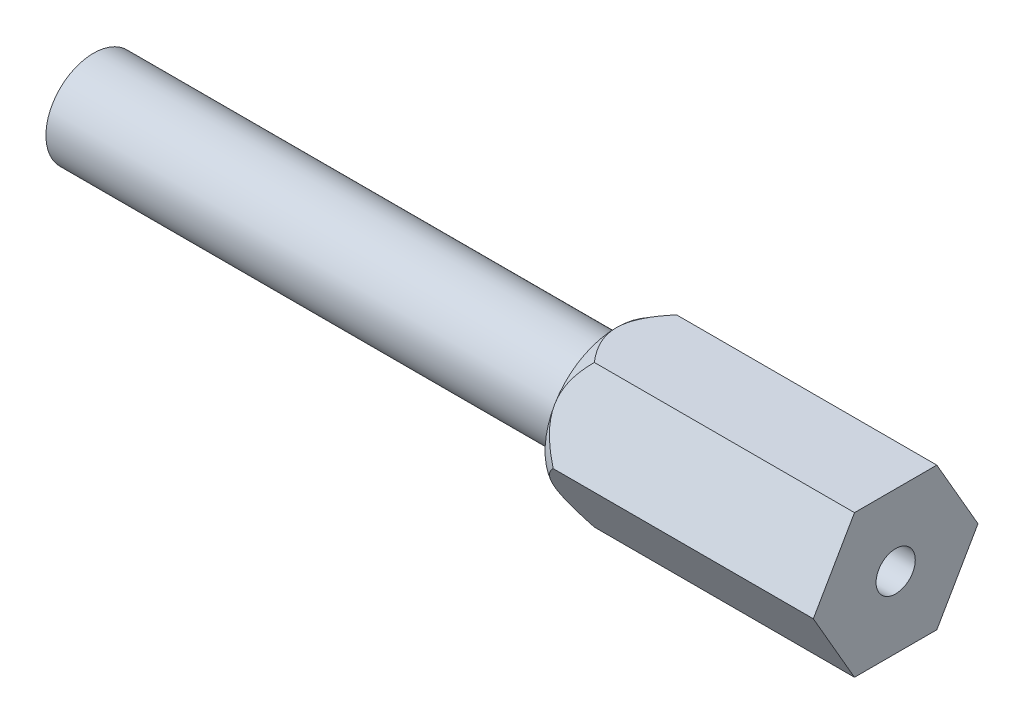
ISO-10303-21;
HEADER;
FILE_DESCRIPTION(('STEP AP214'),'2;1');
FILE_NAME('part.step','',(''),(''),'','','');
FILE_SCHEMA(('AUTOMOTIVE_DESIGN { 1 0 10303 214 1 1 1 1 }'));
ENDSEC;
DATA;
#1=APPLICATION_CONTEXT('core data for automotive mechanical design processes');
#2=APPLICATION_PROTOCOL_DEFINITION('international standard','automotive_design',2000,#1);
#3=PRODUCT_CONTEXT('',#1,'mechanical');
#4=PRODUCT('Part','Part','',(#3));
#5=PRODUCT_RELATED_PRODUCT_CATEGORY('part','',(#4));
#6=PRODUCT_DEFINITION_FORMATION('','',#4);
#7=PRODUCT_DEFINITION_CONTEXT('part definition',#1,'design');
#8=PRODUCT_DEFINITION('design','',#6,#7);
#9=PRODUCT_DEFINITION_SHAPE('','',#8);
#10=(LENGTH_UNIT() NAMED_UNIT(*) SI_UNIT(.MILLI.,.METRE.));
#11=(NAMED_UNIT(*) PLANE_ANGLE_UNIT() SI_UNIT($,.RADIAN.));
#12=(NAMED_UNIT(*) SI_UNIT($,.STERADIAN.) SOLID_ANGLE_UNIT());
#13=UNCERTAINTY_MEASURE_WITH_UNIT(LENGTH_MEASURE(1.E-05),#10,'distance_accuracy_value','');
#14=(GEOMETRIC_REPRESENTATION_CONTEXT(3) GLOBAL_UNCERTAINTY_ASSIGNED_CONTEXT((#13)) GLOBAL_UNIT_ASSIGNED_CONTEXT((#10,
#11,#12)) REPRESENTATION_CONTEXT('',''));
#15=CARTESIAN_POINT('',(0.,0.,0.));
#16=DIRECTION('',(0.,0.,1.));
#17=DIRECTION('',(1.,0.,0.));
#18=AXIS2_PLACEMENT_3D('',#15,#16,#17);
#19=CARTESIAN_POINT('',(-67.5,-5.99999999999996,-3.46410161513783));
#20=DIRECTION('',(0.,-0.499999999999995,-0.866025403784441));
#21=DIRECTION('',(0.,0.866025403784442,-0.499999999999995));
#22=AXIS2_PLACEMENT_3D('',#19,#20,#21);
#23=PLANE('',#22);
#24=CARTESIAN_POINT('',(-21.8921048454132,0.000199995000340876,-6.9283186974428));
#25=CARTESIAN_POINT('',(-21.9548567608909,-0.0625552143430573,-6.89208696043534));
#26=CARTESIAN_POINT('',(-22.0167717261081,-0.125936602015651,-6.85549369920095));
#27=CARTESIAN_POINT('',(-22.1386944411042,-0.254089561609669,-6.7815045534819));
#28=CARTESIAN_POINT('',(-22.1987016418154,-0.318861524921655,-6.74410844302778));
#29=CARTESIAN_POINT('',(-22.3760584208944,-0.516083251212475,-6.63024242626374));
#30=CARTESIAN_POINT('',(-22.4900986231927,-0.650802011472642,-6.55246251376264));
#31=CARTESIAN_POINT('',(-22.7093057282271,-0.930726936783738,-6.39084778278139));
#32=CARTESIAN_POINT('',(-22.8141672543392,-1.07611413083928,-6.3069084471567));
#33=CARTESIAN_POINT('',(-23.0071765097268,-1.37476445413351,-6.13448260260921));
#34=CARTESIAN_POINT('',(-23.0953611949531,-1.52800918910396,-6.04600671362213));
#35=CARTESIAN_POINT('',(-23.2145100111916,-1.77089176583291,-5.90577839256621));
#36=CARTESIAN_POINT('',(-23.253235171572,-1.85768641614649,-5.85566747784344));
#37=CARTESIAN_POINT('',(-23.3231790903496,-2.0335489364393,-5.75413320441203));
#38=CARTESIAN_POINT('',(-23.3543972867018,-2.12261697607485,-5.70270974775224));
#39=CARTESIAN_POINT('',(-23.4081338669026,-2.301963377707,-5.59916405449173));
#40=CARTESIAN_POINT('',(-23.4307191663737,-2.39222657619592,-5.54705057254624));
#41=CARTESIAN_POINT('',(-23.4667215256768,-2.57411139100415,-5.44203932575521));
#42=CARTESIAN_POINT('',(-23.4801403006542,-2.66573274991882,-5.3891417095223));
#43=CARTESIAN_POINT('',(-23.4973532223384,-2.85050959355515,-5.28246074910886));
#44=CARTESIAN_POINT('',(-23.5010575383414,-2.94367143510179,-5.22867373481371));
#45=CARTESIAN_POINT('',(-23.4984218187315,-3.12988635018736,-5.12116250346193));
#46=CARTESIAN_POINT('',(-23.4920818176313,-3.22293942409892,-5.06743828619017));
#47=CARTESIAN_POINT('',(-23.4696052794702,-3.40835003775883,-4.96039141848301));
#48=CARTESIAN_POINT('',(-23.4534474398254,-3.50070562169227,-4.90706989723787));
#49=CARTESIAN_POINT('',(-23.4119579381049,-3.68389443017688,-4.80130578934676));
#50=CARTESIAN_POINT('',(-23.3866207527425,-3.77472670363747,-4.74886375181318));
#51=CARTESIAN_POINT('',(-23.3191529556127,-3.98026137184518,-4.63019825579566));
#52=CARTESIAN_POINT('',(-23.2742862871462,-4.0942898052736,-4.56436390906049));
#53=CARTESIAN_POINT('',(-23.1729245447686,-4.31841563544126,-4.43496480068085));
#54=CARTESIAN_POINT('',(-23.1164222964055,-4.42851055740832,-4.37140146784675));
#55=CARTESIAN_POINT('',(-22.9936220337617,-4.64503724591743,-4.24638972594929));
#56=CARTESIAN_POINT('',(-22.9272854080946,-4.75145243651704,-4.18495088701073));
#57=CARTESIAN_POINT('',(-22.7868049371953,-4.9602797801282,-4.06438436396268));
#58=CARTESIAN_POINT('',(-22.7126623768061,-5.06269258813143,-4.00525630169355));
#59=CARTESIAN_POINT('',(-22.522038683969,-5.31069121272564,-3.86207422902543));
#60=CARTESIAN_POINT('',(-22.4019173129312,-5.45417752270937,-3.7792323693313));
#61=CARTESIAN_POINT('',(-22.2149227160965,-5.66348169593888,-3.65839054857473));
#62=CARTESIAN_POINT('',(-22.1518313066628,-5.73189180456144,-3.6188939539462));
#63=CARTESIAN_POINT('',(-22.0235053566614,-5.86716554714801,-3.54079362224956));
#64=CARTESIAN_POINT('',(-21.9582712611933,-5.93402949743867,-3.50218970255017));
#65=CARTESIAN_POINT('',(-21.8921048454132,-6.0001999950003,-3.46398614797055));
#66=B_SPLINE_CURVE_WITH_KNOTS('',3,(#24,#25,#26,#27,#28,#29,#30,#31,#32,#33,#34,#35,#36,#37,#38,
#39,#40,#41,#42,#43,#44,#45,#46,#47,#48,#49,#50,#51,#52,#53,#54,#55,#56,#57,#58,#59,#60,#61,#62,
#63,#64,#65),.UNSPECIFIED.,.F.,.F.,(4,2,2,2,2,2,2,2,2,2,2,2,2,2,2,2,2,2,2,2,4),(0.,
0.28756100822779,0.575204042743462,1.15341981754294,1.74657454533942,2.33839902909644,
2.66048498841609,2.98259505474562,3.30215513549797,3.6216554070741,3.94409988279589,
4.26654325058649,4.58968876152158,4.91302903555297,5.3296565678419,5.74654176433873,
6.16510933349185,6.58360811456267,7.196955652563,7.50021905004793,7.80341984425696),.UNSPECIFIED.);
#67=CARTESIAN_POINT('',(-21.8923048454132,0.,-6.92820323027551));
#68=VERTEX_POINT('',#67);
#69=CARTESIAN_POINT('',(-23.5,-2.99999999999998,-5.19615242270667));
#70=VERTEX_POINT('',#69);
#71=EDGE_CURVE('E123',#68,#70,#66,.T.);
#72=ORIENTED_EDGE('',*,*,#71,.F.);
#73=DIRECTION('',(1.,0.,0.));
#74=VECTOR('',#73,1.);
#75=CARTESIAN_POINT('',(-67.5,0.,-6.92820323027551));
#76=LINE('',#75,#74);
#77=CARTESIAN_POINT('',(0.,0.,-6.92820323027551));
#78=VERTEX_POINT('',#77);
#79=EDGE_CURVE('E130',#68,#78,#76,.T.);
#80=ORIENTED_EDGE('',*,*,#79,.T.);
#81=DIRECTION('',(0.,0.866025403784441,-0.499999999999995));
#82=VECTOR('',#81,1.);
#83=CARTESIAN_POINT('',(0.,-5.99999999999996,-3.46410161513783));
#84=LINE('',#83,#82);
#85=CARTESIAN_POINT('',(0.,-5.99999999999996,-3.46410161513783));
#86=VERTEX_POINT('',#85);
#87=EDGE_CURVE('E162',#86,#78,#84,.T.);
#88=ORIENTED_EDGE('',*,*,#87,.F.);
#89=DIRECTION('',(1.,0.,0.));
#90=VECTOR('',#89,1.);
#91=CARTESIAN_POINT('',(-67.5,-5.99999999999996,-3.46410161513783));
#92=LINE('',#91,#90);
#93=CARTESIAN_POINT('',(-21.8923048454132,-5.99999999999996,-3.46410161513783));
#94=VERTEX_POINT('',#93);
#95=EDGE_CURVE('E64',#94,#86,#92,.T.);
#96=ORIENTED_EDGE('',*,*,#95,.F.);
#97=EDGE_CURVE('E132',#70,#94,#66,.T.);
#98=ORIENTED_EDGE('',*,*,#97,.F.);
#99=EDGE_LOOP('',(#72,#80,#88,#96,#98));
#100=FACE_BOUND('',#99,.T.);
#101=ADVANCED_FACE('F37',(#100),#23,.T.);
#102=CARTESIAN_POINT('',(-67.5,-6.00000000000004,3.4641016151377));
#103=DIRECTION('',(0.,-1.,0.));
#104=DIRECTION('',(0.,0.,-1.));
#105=AXIS2_PLACEMENT_3D('',#102,#103,#104);
#106=PLANE('',#105);
#107=CARTESIAN_POINT('',(-19.1251268648373,-5.99999999999994,-6.05721458290324));
#108=CARTESIAN_POINT('',(-19.2797348823343,-5.99999999999994,-5.93154496881868));
#109=CARTESIAN_POINT('',(-19.4334292818163,-5.99999999999994,-5.80473415430144));
#110=CARTESIAN_POINT('',(-19.7385950984431,-5.99999999999994,-5.54838639242511));
#111=CARTESIAN_POINT('',(-19.8900659124382,-5.99999999999994,-5.41884872777824));
#112=CARTESIAN_POINT('',(-20.1917074141577,-5.99999999999995,-5.15544627120731));
#113=CARTESIAN_POINT('',(-20.3418527635634,-5.99999999999995,-5.02155237276275));
#114=CARTESIAN_POINT('',(-20.6387575536055,-5.99999999999995,-4.75007974004604));
#115=CARTESIAN_POINT('',(-20.7855173113866,-5.99999999999995,-4.61250135354798));
#116=CARTESIAN_POINT('',(-21.0842684881926,-5.99999999999995,-4.32390846348654));
#117=CARTESIAN_POINT('',(-21.235979247956,-5.99999999999996,-4.17260209237981));
#118=CARTESIAN_POINT('',(-21.5333620816658,-5.99999999999996,-3.86405664967895));
#119=CARTESIAN_POINT('',(-21.679032607606,-5.99999999999996,-3.70681607673503));
#120=CARTESIAN_POINT('',(-21.9618513139366,-5.99999999999996,-3.3858913195862));
#121=CARTESIAN_POINT('',(-22.0990304485888,-5.99999999999997,-3.22223458729759));
#122=CARTESIAN_POINT('',(-22.3627505411691,-5.99999999999997,-2.88662069742006));
#123=CARTESIAN_POINT('',(-22.489298719563,-5.99999999999997,-2.71466930052393));
#124=CARTESIAN_POINT('',(-22.686703760084,-5.99999999999998,-2.42208479767754));
#125=CARTESIAN_POINT('',(-22.7616955981273,-5.99999999999998,-2.30424771174366));
#126=CARTESIAN_POINT('',(-22.9040590291489,-5.99999999999998,-2.06396128472085));
#127=CARTESIAN_POINT('',(-22.971428128924,-5.99999999999998,-1.94151045194878));
#128=CARTESIAN_POINT('',(-23.0961414157094,-5.99999999999998,-1.69303843986658));
#129=CARTESIAN_POINT('',(-23.1535757798036,-5.99999999999998,-1.56706292045833));
#130=CARTESIAN_POINT('',(-23.2571716862758,-5.99999999999999,-1.31055104954188));
#131=CARTESIAN_POINT('',(-23.3033384316727,-5.99999999999999,-1.18001683504268));
#132=CARTESIAN_POINT('',(-23.3718875490916,-5.99999999999999,-0.949898826116907));
#133=CARTESIAN_POINT('',(-23.3973316025657,-5.99999999999999,-0.851225633463846));
#134=CARTESIAN_POINT('',(-23.4401902243902,-5.99999999999999,-0.652158326464795));
#135=CARTESIAN_POINT('',(-23.4576070529728,-5.99999999999999,-0.55176470480922));
#136=CARTESIAN_POINT('',(-23.4838061182648,-6.,-0.349871060508904));
#137=CARTESIAN_POINT('',(-23.4925903895644,-6.,-0.248371304271603));
#138=CARTESIAN_POINT('',(-23.5011997537673,-6.,-0.044987098022777));
#139=CARTESIAN_POINT('',(-23.501024656561,-6.,0.0568973601059055));
#140=CARTESIAN_POINT('',(-23.4917193443625,-6.,0.260214020698756));
#141=CARTESIAN_POINT('',(-23.4825928452086,-6.,0.361646393278742));
#142=CARTESIAN_POINT('',(-23.4557455339872,-6.00000000000001,0.563381112892102));
#143=CARTESIAN_POINT('',(-23.4380211812275,-6.00000000000001,0.663682976941724));
#144=CARTESIAN_POINT('',(-23.3728010208663,-6.00000000000001,0.96200488659224));
#145=CARTESIAN_POINT('',(-23.3132566371592,-6.00000000000001,1.15746797749296));
#146=CARTESIAN_POINT('',(-23.1837449392171,-6.00000000000002,1.49874927862231));
#147=CARTESIAN_POINT('',(-23.1185040032049,-6.00000000000002,1.64645301725931));
#148=CARTESIAN_POINT('',(-22.9752415346378,-6.00000000000002,1.935612851291));
#149=CARTESIAN_POINT('',(-22.8972112698493,-6.00000000000002,2.07706459360795));
#150=CARTESIAN_POINT('',(-22.7302167755532,-6.00000000000002,2.35541801279149));
#151=CARTESIAN_POINT('',(-22.6411413141934,-6.00000000000003,2.49225219046443));
#152=CARTESIAN_POINT('',(-22.5015429714976,-6.00000000000003,2.69324571929462));
#153=CARTESIAN_POINT('',(-22.4540222773795,-6.00000000000003,2.75952173222918));
#154=CARTESIAN_POINT('',(-22.3571934913056,-6.00000000000003,2.89075343237864));
#155=CARTESIAN_POINT('',(-22.3078854412316,-6.00000000000003,2.95570915047553));
#156=CARTESIAN_POINT('',(-22.1488723217305,-6.00000000000003,3.15991025709909));
#157=CARTESIAN_POINT('',(-22.036210902955,-6.00000000000004,3.29685943270153));
#158=CARTESIAN_POINT('',(-21.8050177330924,-6.00000000000004,3.56573231122703));
#159=CARTESIAN_POINT('',(-21.6864842676741,-6.00000000000004,3.69765452641472));
#160=CARTESIAN_POINT('',(-21.4446467646935,-6.00000000000004,3.95727874151413));
#161=CARTESIAN_POINT('',(-21.321338162366,-6.00000000000004,4.08497647551761));
#162=CARTESIAN_POINT('',(-21.0709468238773,-6.00000000000005,4.33662578482552));
#163=CARTESIAN_POINT('',(-20.9438636942032,-6.00000000000005,4.46057696679622));
#164=CARTESIAN_POINT('',(-20.5565848775553,-6.00000000000005,4.828962341001));
#165=CARTESIAN_POINT('',(-20.2917247268562,-6.00000000000005,5.06849283967064));
#166=CARTESIAN_POINT('',(-19.7536471209267,-6.00000000000006,5.53756386647138));
#167=CARTESIAN_POINT('',(-19.4804342126379,-6.00000000000006,5.76710967064784));
#168=CARTESIAN_POINT('',(-18.9553195149949,-6.00000000000007,6.19611354176209));
#169=CARTESIAN_POINT('',(-18.7040039571246,-6.00000000000007,6.39629192290881));
#170=CARTESIAN_POINT('',(-18.1974544023576,-6.00000000000007,6.79169549264493));
#171=CARTESIAN_POINT('',(-17.9422198003222,-6.00000000000007,6.98691990369314));
#172=CARTESIAN_POINT('',(-17.4318819448973,-6.00000000000008,7.37090061135094));
#173=CARTESIAN_POINT('',(-17.1768163572279,-6.00000000000008,7.55970710786532));
#174=CARTESIAN_POINT('',(-16.6643238466755,-6.00000000000008,7.93393805324931));
#175=CARTESIAN_POINT('',(-16.4068976082875,-6.00000000000009,8.11936343863768));
#176=CARTESIAN_POINT('',(-16.1485279997164,-6.00000000000009,8.3034454043664));
#177=B_SPLINE_CURVE_WITH_KNOTS('',3,(#107,#108,#109,#110,#111,#112,#113,#114,#115,#116,#117,
#118,#119,#120,#121,#122,#123,#124,#125,#126,#127,#128,#129,#130,#131,#132,#133,#134,#135,#136,
#137,#138,#139,#140,#141,#142,#143,#144,#145,#146,#147,#148,#149,#150,#151,#152,#153,#154,#155,
#156,#157,#158,#159,#160,#161,#162,#163,#164,#165,#166,#167,#168,#169,#170,#171,#172,#173,#174,
#175,#176),.UNSPECIFIED.,.F.,.F.,(4,2,2,2,2,2,2,2,2,2,2,2,2,2,2,2,2,2,2,2,2,2,2,2,2,2,2,2,2,2,2,
2,2,2,4),(0.,0.597730087565498,1.19561942068601,1.79909036013502,2.40250453811221,
3.04516926488092,3.68799769004703,4.32832493509556,4.96821369797721,5.38701512681665,
5.80595314136078,6.22086231335501,6.63557952978658,6.94098859321395,7.24631160974405,
7.55156264803413,7.85682016347831,8.16195101634077,8.46720763231545,9.07764154404116,
9.56141281214161,10.0455157737566,10.5349648789947,10.7795963459889,11.0242220844029,
11.5559927095612,12.0879195095934,12.6203680015874,13.1528722001662,14.2238155081971,
15.2941858647781,16.2579957369079,17.2219559579231,18.173955365682,19.1256869501579),.UNSPECIFIED.);
#178=CARTESIAN_POINT('',(-23.5,-6.,0.));
#179=VERTEX_POINT('',#178);
#180=EDGE_CURVE('E178',#94,#179,#177,.T.);
#181=ORIENTED_EDGE('',*,*,#180,.F.);
#182=ORIENTED_EDGE('',*,*,#95,.T.);
#183=DIRECTION('',(0.,0.,-1.));
#184=VECTOR('',#183,1.);
#185=CARTESIAN_POINT('',(0.,-6.00000000000004,3.4641016151377));
#186=LINE('',#185,#184);
#187=CARTESIAN_POINT('',(0.,-6.00000000000004,3.4641016151377));
#188=VERTEX_POINT('',#187);
#189=EDGE_CURVE('E140',#188,#86,#186,.T.);
#190=ORIENTED_EDGE('',*,*,#189,.F.);
#191=DIRECTION('',(1.,0.,0.));
#192=VECTOR('',#191,1.);
#193=CARTESIAN_POINT('',(-67.5,-6.00000000000004,3.4641016151377));
#194=LINE('',#193,#192);
#195=CARTESIAN_POINT('',(-21.8923048454132,-6.00000000000004,3.4641016151377));
#196=VERTEX_POINT('',#195);
#197=EDGE_CURVE('E150',#196,#188,#194,.T.);
#198=ORIENTED_EDGE('',*,*,#197,.F.);
#199=EDGE_CURVE('E179',#179,#196,#177,.T.);
#200=ORIENTED_EDGE('',*,*,#199,.F.);
#201=EDGE_LOOP('',(#181,#182,#190,#198,#200));
#202=FACE_BOUND('',#201,.T.);
#203=ADVANCED_FACE('F225',(#202),#106,.T.);
#204=CARTESIAN_POINT('',(-67.5,0.,6.92820323027551));
#205=DIRECTION('',(0.,-0.500000000000007,0.866025403784435));
#206=DIRECTION('',(0.,-0.866025403784435,-0.500000000000007));
#207=AXIS2_PLACEMENT_3D('',#204,#205,#206);
#208=PLANE('',#207);
#209=CARTESIAN_POINT('',(-21.8921048454132,-6.00019999500037,3.46398614797042));
#210=CARTESIAN_POINT('',(-21.9548567608909,-5.93744478565697,3.50021788497789));
#211=CARTESIAN_POINT('',(-22.0167717261081,-5.87406339798438,3.53681114621227));
#212=CARTESIAN_POINT('',(-22.1386944411043,-5.74591043839036,3.61080029193132));
#213=CARTESIAN_POINT('',(-22.1987016418154,-5.68113847507838,3.64819640238544));
#214=CARTESIAN_POINT('',(-22.3760584208944,-5.48391674878756,3.76206241914949));
#215=CARTESIAN_POINT('',(-22.4900986231927,-5.3491979885274,3.83984233165059));
#216=CARTESIAN_POINT('',(-22.7093057282271,-5.0692730632163,4.00145706263184));
#217=CARTESIAN_POINT('',(-22.8141672543392,-4.92388586916076,4.08539639825653));
#218=CARTESIAN_POINT('',(-23.0071765097269,-4.62523554586654,4.25782224280402));
#219=CARTESIAN_POINT('',(-23.0953611949531,-4.47199081089609,4.3462981317911));
#220=CARTESIAN_POINT('',(-23.2145100111916,-4.22910823416715,4.48652645284703));
#221=CARTESIAN_POINT('',(-23.253235171572,-4.14231358385357,4.5366373675698));
#222=CARTESIAN_POINT('',(-23.3231790903496,-3.96645106356076,4.63817164100122));
#223=CARTESIAN_POINT('',(-23.3543972867018,-3.8773830239252,4.689595097661));
#224=CARTESIAN_POINT('',(-23.4081338669026,-3.69803662229306,4.79314079092151));
#225=CARTESIAN_POINT('',(-23.4307191663738,-3.60777342380414,4.845254272867));
#226=CARTESIAN_POINT('',(-23.4667215256768,-3.42588860899591,4.95026551965805));
#227=CARTESIAN_POINT('',(-23.4801403006543,-3.33426725008125,5.00316313589095));
#228=CARTESIAN_POINT('',(-23.4973532223384,-3.14949040644491,5.1098440963044));
#229=CARTESIAN_POINT('',(-23.5010575383415,-3.05632856489828,5.16363111059955));
#230=CARTESIAN_POINT('',(-23.4984218187316,-2.87011364981271,5.27114234195132));
#231=CARTESIAN_POINT('',(-23.4920818176314,-2.77706057590115,5.32486655922309));
#232=CARTESIAN_POINT('',(-23.4696052794703,-2.59164996224124,5.43191342693025));
#233=CARTESIAN_POINT('',(-23.4534474398254,-2.4992943783078,5.48523494817539));
#234=CARTESIAN_POINT('',(-23.411957938105,-2.31610556982319,5.59099905606651));
#235=CARTESIAN_POINT('',(-23.3866207527425,-2.2252732963626,5.64344109360009));
#236=CARTESIAN_POINT('',(-23.3191529556127,-2.0197386281549,5.76210658961761));
#237=CARTESIAN_POINT('',(-23.2742862871463,-1.90571019472647,5.82794093635278));
#238=CARTESIAN_POINT('',(-23.1729245447687,-1.68158436455881,5.95734004473243));
#239=CARTESIAN_POINT('',(-23.1164222964056,-1.57148944259176,6.02090337756652));
#240=CARTESIAN_POINT('',(-22.9936220337618,-1.35496275408266,6.14591511946399));
#241=CARTESIAN_POINT('',(-22.9272854080947,-1.24854756348305,6.20735395840254));
#242=CARTESIAN_POINT('',(-22.7868049371954,-1.0397202198719,6.3279204814506));
#243=CARTESIAN_POINT('',(-22.7126623768061,-0.937307411868663,6.38704854371973));
#244=CARTESIAN_POINT('',(-22.522038683969,-0.689308787274446,6.53023061638786));
#245=CARTESIAN_POINT('',(-22.4019173129312,-0.545822477290697,6.613072476082));
#246=CARTESIAN_POINT('',(-22.2149227160966,-0.336518304061161,6.73391429683859));
#247=CARTESIAN_POINT('',(-22.1518313066628,-0.26810819543859,6.77341089146712));
#248=CARTESIAN_POINT('',(-22.0235053566615,-0.132834452852006,6.85151122316378));
#249=CARTESIAN_POINT('',(-21.9582712611933,-0.0659705025613465,6.89011514286317));
#250=CARTESIAN_POINT('',(-21.8921048454132,0.000199995000291808,6.9283186974428));
#251=B_SPLINE_CURVE_WITH_KNOTS('',3,(#209,#210,#211,#212,#213,#214,#215,#216,#217,#218,#219,
#220,#221,#222,#223,#224,#225,#226,#227,#228,#229,#230,#231,#232,#233,#234,#235,#236,#237,#238,
#239,#240,#241,#242,#243,#244,#245,#246,#247,#248,#249,#250),.UNSPECIFIED.,.F.,.F.,(4,2,2,2,2,2,
2,2,2,2,2,2,2,2,2,2,2,2,2,2,4),(0.,0.287561008227792,0.575204042743462,1.15341981754294,
1.74657454533942,2.33839902909644,2.66048498841609,2.98259505474561,3.30215513549797,
3.6216554070741,3.94409988279588,4.26654325058649,4.58968876152158,4.91302903555298,
5.32965656784189,5.74654176433872,6.16510933349183,6.58360811456263,7.19695565256305,
7.50021905004802,7.80341984425708),.UNSPECIFIED.);
#252=CARTESIAN_POINT('',(-23.5,-3.00000000000004,5.19615242270661));
#253=VERTEX_POINT('',#252);
#254=EDGE_CURVE('E219',#196,#253,#251,.T.);
#255=ORIENTED_EDGE('',*,*,#254,.F.);
#256=ORIENTED_EDGE('',*,*,#197,.T.);
#257=DIRECTION('',(0.,-0.866025403784435,-0.500000000000007));
#258=VECTOR('',#257,1.);
#259=CARTESIAN_POINT('',(0.,0.,6.92820323027551));
#260=LINE('',#259,#258);
#261=CARTESIAN_POINT('',(0.,0.,6.92820323027551));
#262=VERTEX_POINT('',#261);
#263=EDGE_CURVE('E144',#262,#188,#260,.T.);
#264=ORIENTED_EDGE('',*,*,#263,.F.);
#265=DIRECTION('',(1.,0.,0.));
#266=VECTOR('',#265,1.);
#267=CARTESIAN_POINT('',(-67.5,0.,6.92820323027551));
#268=LINE('',#267,#266);
#269=CARTESIAN_POINT('',(-21.8923048454132,0.,6.92820323027551));
#270=VERTEX_POINT('',#269);
#271=EDGE_CURVE('E148',#270,#262,#268,.T.);
#272=ORIENTED_EDGE('',*,*,#271,.F.);
#273=EDGE_CURVE('E214',#253,#270,#251,.T.);
#274=ORIENTED_EDGE('',*,*,#273,.F.);
#275=EDGE_LOOP('',(#255,#256,#264,#272,#274));
#276=FACE_BOUND('',#275,.T.);
#277=ADVANCED_FACE('F221',(#276),#208,.T.);
#278=CARTESIAN_POINT('',(-67.5,5.99999999999999,3.46410161513778));
#279=DIRECTION('',(0.,0.499999999999995,0.866025403784442));
#280=DIRECTION('',(0.,-0.866025403784442,0.499999999999995));
#281=AXIS2_PLACEMENT_3D('',#278,#279,#280);
#282=PLANE('',#281);
#283=CARTESIAN_POINT('',(-21.8921048454132,-0.000199995000388335,6.9283186974428));
#284=CARTESIAN_POINT('',(-21.9548567608909,0.0625552143430092,6.89208696043533));
#285=CARTESIAN_POINT('',(-22.0167717261081,0.125936602015603,6.85549369920095));
#286=CARTESIAN_POINT('',(-22.1386944411042,0.25408956160962,6.7815045534819));
#287=CARTESIAN_POINT('',(-22.1987016418154,0.318861524921606,6.74410844302778));
#288=CARTESIAN_POINT('',(-22.3760584208944,0.516083251212425,6.63024242626374));
#289=CARTESIAN_POINT('',(-22.4900986231927,0.650802011472591,6.55246251376264));
#290=CARTESIAN_POINT('',(-22.7093057282271,0.930726936783684,6.3908477827814));
#291=CARTESIAN_POINT('',(-22.8141672543392,1.07611413083923,6.30690844715671));
#292=CARTESIAN_POINT('',(-23.0071765097268,1.37476445413345,6.13448260260922));
#293=CARTESIAN_POINT('',(-23.0953611949531,1.5280091891039,6.04600671362214));
#294=CARTESIAN_POINT('',(-23.2145100111916,1.77089176583285,5.90577839256621));
#295=CARTESIAN_POINT('',(-23.253235171572,1.85768641614643,5.85566747784345));
#296=CARTESIAN_POINT('',(-23.3231790903496,2.03354893643924,5.75413320441203));
#297=CARTESIAN_POINT('',(-23.3543972867018,2.12261697607479,5.70270974775225));
#298=CARTESIAN_POINT('',(-23.4081338669026,2.30196337770694,5.59916405449174));
#299=CARTESIAN_POINT('',(-23.4307191663738,2.39222657619586,5.54705057254625));
#300=CARTESIAN_POINT('',(-23.4667215256768,2.57411139100409,5.44203932575521));
#301=CARTESIAN_POINT('',(-23.4801403006543,2.66573274991876,5.38914170952231));
#302=CARTESIAN_POINT('',(-23.4973532223384,2.85050959355509,5.28246074910887));
#303=CARTESIAN_POINT('',(-23.5010575383415,2.94367143510173,5.22867373481371));
#304=CARTESIAN_POINT('',(-23.4984218187316,3.1298863501873,5.12116250346194));
#305=CARTESIAN_POINT('',(-23.4920818176314,3.22293942409886,5.06743828619018));
#306=CARTESIAN_POINT('',(-23.4696052794703,3.40835003775877,4.96039141848301));
#307=CARTESIAN_POINT('',(-23.4534474398254,3.50070562169221,4.90706989723788));
#308=CARTESIAN_POINT('',(-23.411957938105,3.68389443017683,4.80130578934676));
#309=CARTESIAN_POINT('',(-23.3866207527425,3.77472670363741,4.74886375181319));
#310=CARTESIAN_POINT('',(-23.3191529556127,3.98026137184512,4.63019825579567));
#311=CARTESIAN_POINT('',(-23.2742862871463,4.09428980527354,4.5643639090605));
#312=CARTESIAN_POINT('',(-23.1729245447687,4.3184156354412,4.43496480068085));
#313=CARTESIAN_POINT('',(-23.1164222964056,4.42851055740825,4.37140146784676));
#314=CARTESIAN_POINT('',(-22.9936220337618,4.64503724591736,4.2463897259493));
#315=CARTESIAN_POINT('',(-22.9272854080947,4.75145243651697,4.18495088701075));
#316=CARTESIAN_POINT('',(-22.7868049371954,4.96027978012812,4.0643843639627));
#317=CARTESIAN_POINT('',(-22.7126623768061,5.06269258813136,4.00525630169356));
#318=CARTESIAN_POINT('',(-22.5220386839691,5.31069121272558,3.86207422902544));
#319=CARTESIAN_POINT('',(-22.4019173129313,5.45417752270933,3.77923236933129));
#320=CARTESIAN_POINT('',(-22.2149227160966,5.66348169593886,3.65839054857471));
#321=CARTESIAN_POINT('',(-22.1518313066628,5.73189180456143,3.61889395394618));
#322=CARTESIAN_POINT('',(-22.0235053566615,5.86716554714802,3.54079362224952));
#323=CARTESIAN_POINT('',(-21.9582712611933,5.93402949743868,3.50218970255013));
#324=CARTESIAN_POINT('',(-21.8921048454132,6.00019999500032,3.46398614797051));
#325=B_SPLINE_CURVE_WITH_KNOTS('',3,(#283,#284,#285,#286,#287,#288,#289,#290,#291,#292,#293,
#294,#295,#296,#297,#298,#299,#300,#301,#302,#303,#304,#305,#306,#307,#308,#309,#310,#311,#312,
#313,#314,#315,#316,#317,#318,#319,#320,#321,#322,#323,#324),.UNSPECIFIED.,.F.,.F.,(4,2,2,2,2,2,
2,2,2,2,2,2,2,2,2,2,2,2,2,2,4),(0.,0.287561008227792,0.575204042743462,1.15341981754294,
1.74657454533942,2.33839902909644,2.66048498841609,2.98259505474561,3.30215513549798,
3.6216554070741,3.94409988279589,4.2665432505865,4.58968876152159,4.91302903555298,
5.32965656784189,5.74654176433872,6.16510933349184,6.58360811456263,7.19695565256305,
7.50021905004801,7.80341984425708),.UNSPECIFIED.);
#326=CARTESIAN_POINT('',(-23.5,2.99999999999997,5.19615242270665));
#327=VERTEX_POINT('',#326);
#328=EDGE_CURVE('E220',#270,#327,#325,.T.);
#329=ORIENTED_EDGE('',*,*,#328,.F.);
#330=ORIENTED_EDGE('',*,*,#271,.T.);
#331=DIRECTION('',(0.,-0.866025403784441,0.499999999999995));
#332=VECTOR('',#331,1.);
#333=CARTESIAN_POINT('',(0.,5.99999999999999,3.46410161513778));
#334=LINE('',#333,#332);
#335=CARTESIAN_POINT('',(0.,5.99999999999999,3.46410161513778));
#336=VERTEX_POINT('',#335);
#337=EDGE_CURVE('E155',#336,#262,#334,.T.);
#338=ORIENTED_EDGE('',*,*,#337,.F.);
#339=DIRECTION('',(1.,0.,0.));
#340=VECTOR('',#339,1.);
#341=CARTESIAN_POINT('',(-67.5,5.99999999999999,3.46410161513778));
#342=LINE('',#341,#340);
#343=CARTESIAN_POINT('',(-21.8923048454132,5.99999999999999,3.46410161513779));
#344=VERTEX_POINT('',#343);
#345=EDGE_CURVE('E141',#344,#336,#342,.T.);
#346=ORIENTED_EDGE('',*,*,#345,.F.);
#347=EDGE_CURVE('E209',#327,#344,#325,.T.);
#348=ORIENTED_EDGE('',*,*,#347,.F.);
#349=EDGE_LOOP('',(#329,#330,#338,#346,#348));
#350=FACE_BOUND('',#349,.T.);
#351=ADVANCED_FACE('F224',(#350),#282,.T.);
#352=CARTESIAN_POINT('',(-67.5,6.00000000000001,-3.46410161513774));
#353=DIRECTION('',(0.,1.,0.));
#354=DIRECTION('',(0.,0.,1.));
#355=AXIS2_PLACEMENT_3D('',#352,#353,#354);
#356=PLANE('',#355);
#357=CARTESIAN_POINT('',(-19.1251268648373,6.00000000000002,-6.05721458290315));
#358=CARTESIAN_POINT('',(-19.2797348823343,6.00000000000002,-5.93154496881859));
#359=CARTESIAN_POINT('',(-19.4334292818164,6.00000000000002,-5.80473415430135));
#360=CARTESIAN_POINT('',(-19.7385950984431,6.00000000000002,-5.54838639242502));
#361=CARTESIAN_POINT('',(-19.8900659124382,6.00000000000002,-5.41884872777815));
#362=CARTESIAN_POINT('',(-20.1917074141578,6.00000000000002,-5.15544627120722));
#363=CARTESIAN_POINT('',(-20.3418527635634,6.00000000000002,-5.02155237276266));
#364=CARTESIAN_POINT('',(-20.6387575536055,6.00000000000002,-4.75007974004595));
#365=CARTESIAN_POINT('',(-20.7855173113866,6.00000000000002,-4.61250135354789));
#366=CARTESIAN_POINT('',(-21.0842684881926,6.00000000000002,-4.32390846348645));
#367=CARTESIAN_POINT('',(-21.235979247956,6.00000000000002,-4.17260209237973));
#368=CARTESIAN_POINT('',(-21.5333620816658,6.00000000000001,-3.86405664967886));
#369=CARTESIAN_POINT('',(-21.679032607606,6.00000000000001,-3.70681607673494));
#370=CARTESIAN_POINT('',(-21.9618513139366,6.00000000000001,-3.38589131958611));
#371=CARTESIAN_POINT('',(-22.0990304485888,6.00000000000001,-3.22223458729751));
#372=CARTESIAN_POINT('',(-22.3627505411691,6.00000000000001,-2.88662069741998));
#373=CARTESIAN_POINT('',(-22.489298719563,6.00000000000001,-2.71466930052384));
#374=CARTESIAN_POINT('',(-22.686703760084,6.00000000000001,-2.42208479767745));
#375=CARTESIAN_POINT('',(-22.7616955981273,6.00000000000001,-2.30424771174357));
#376=CARTESIAN_POINT('',(-22.9040590291489,6.00000000000001,-2.06396128472076));
#377=CARTESIAN_POINT('',(-22.971428128924,6.00000000000001,-1.94151045194869));
#378=CARTESIAN_POINT('',(-23.0961414157094,6.00000000000001,-1.69303843986649));
#379=CARTESIAN_POINT('',(-23.1535757798036,6.00000000000001,-1.56706292045824));
#380=CARTESIAN_POINT('',(-23.2571716862758,6.00000000000001,-1.3105510495418));
#381=CARTESIAN_POINT('',(-23.3033384316727,6.00000000000001,-1.18001683504259));
#382=CARTESIAN_POINT('',(-23.3718875490916,6.,-0.949898826116822));
#383=CARTESIAN_POINT('',(-23.3973316025657,6.,-0.85122563346376));
#384=CARTESIAN_POINT('',(-23.4401902243902,6.,-0.652158326464709));
#385=CARTESIAN_POINT('',(-23.4576070529728,6.,-0.551764704809134));
#386=CARTESIAN_POINT('',(-23.4838061182648,6.,-0.349871060508819));
#387=CARTESIAN_POINT('',(-23.4925903895644,6.,-0.248371304271518));
#388=CARTESIAN_POINT('',(-23.5011997537673,6.,-0.0449870980226914));
#389=CARTESIAN_POINT('',(-23.501024656561,6.,0.0568973601059913));
#390=CARTESIAN_POINT('',(-23.4917193443625,6.,0.260214020698842));
#391=CARTESIAN_POINT('',(-23.4825928452086,6.,0.361646393278828));
#392=CARTESIAN_POINT('',(-23.4557455339872,6.,0.563381112892189));
#393=CARTESIAN_POINT('',(-23.4380211812275,6.,0.663682976941811));
#394=CARTESIAN_POINT('',(-23.3728010208663,6.,0.962004886592327));
#395=CARTESIAN_POINT('',(-23.3132566371592,6.,1.15746797749304));
#396=CARTESIAN_POINT('',(-23.1837449392171,6.,1.49874927862239));
#397=CARTESIAN_POINT('',(-23.1185040032049,5.99999999999999,1.6464530172594));
#398=CARTESIAN_POINT('',(-22.9752415346378,5.99999999999999,1.93561285129109));
#399=CARTESIAN_POINT('',(-22.8972112698493,5.99999999999999,2.07706459360804));
#400=CARTESIAN_POINT('',(-22.7302167755532,5.99999999999999,2.35541801279158));
#401=CARTESIAN_POINT('',(-22.6411413141934,5.99999999999999,2.49225219046451));
#402=CARTESIAN_POINT('',(-22.5015429714976,5.99999999999999,2.69324571929471));
#403=CARTESIAN_POINT('',(-22.4540222773795,5.99999999999999,2.75952173222926));
#404=CARTESIAN_POINT('',(-22.3571934913056,5.99999999999999,2.89075343237873));
#405=CARTESIAN_POINT('',(-22.3078854412316,5.99999999999999,2.95570915047561));
#406=CARTESIAN_POINT('',(-22.1488723217305,5.99999999999999,3.15991025709918));
#407=CARTESIAN_POINT('',(-22.036210902955,5.99999999999999,3.29685943270161));
#408=CARTESIAN_POINT('',(-21.8050177330923,5.99999999999999,3.56573231122712));
#409=CARTESIAN_POINT('',(-21.6864842676741,5.99999999999999,3.69765452641481));
#410=CARTESIAN_POINT('',(-21.4446467646935,5.99999999999999,3.95727874151422));
#411=CARTESIAN_POINT('',(-21.321338162366,5.99999999999999,4.0849764755177));
#412=CARTESIAN_POINT('',(-21.0709468238773,5.99999999999999,4.33662578482561));
#413=CARTESIAN_POINT('',(-20.9438636942032,5.99999999999998,4.46057696679631));
#414=CARTESIAN_POINT('',(-20.5565848775553,5.99999999999998,4.82896234100109));
#415=CARTESIAN_POINT('',(-20.2917247268562,5.99999999999998,5.06849283967073));
#416=CARTESIAN_POINT('',(-19.7536471209267,5.99999999999998,5.53756386647148));
#417=CARTESIAN_POINT('',(-19.4804342126379,5.99999999999998,5.76710967064794));
#418=CARTESIAN_POINT('',(-18.9553195149949,5.99999999999998,6.19611354176219));
#419=CARTESIAN_POINT('',(-18.7040039571245,5.99999999999998,6.39629192290891));
#420=CARTESIAN_POINT('',(-18.1974544023575,5.99999999999998,6.79169549264503));
#421=CARTESIAN_POINT('',(-17.9422198003222,5.99999999999998,6.98691990369324));
#422=CARTESIAN_POINT('',(-17.4318819448973,5.99999999999997,7.37090061135104));
#423=CARTESIAN_POINT('',(-17.1768163572278,5.99999999999997,7.55970710786541));
#424=CARTESIAN_POINT('',(-16.6643238466755,5.99999999999997,7.9339380532494));
#425=CARTESIAN_POINT('',(-16.4068976082874,5.99999999999997,8.11936343863777));
#426=CARTESIAN_POINT('',(-16.1485279997164,5.99999999999997,8.30344540436649));
#427=B_SPLINE_CURVE_WITH_KNOTS('',3,(#357,#358,#359,#360,#361,#362,#363,#364,#365,#366,#367,
#368,#369,#370,#371,#372,#373,#374,#375,#376,#377,#378,#379,#380,#381,#382,#383,#384,#385,#386,
#387,#388,#389,#390,#391,#392,#393,#394,#395,#396,#397,#398,#399,#400,#401,#402,#403,#404,#405,
#406,#407,#408,#409,#410,#411,#412,#413,#414,#415,#416,#417,#418,#419,#420,#421,#422,#423,#424,
#425,#426),.UNSPECIFIED.,.F.,.F.,(4,2,2,2,2,2,2,2,2,2,2,2,2,2,2,2,2,2,2,2,2,2,2,2,2,2,2,2,2,2,2,
2,2,2,4),(0.,0.597730087565498,1.19561942068601,1.79909036013502,2.40250453811221,
3.04516926488091,3.68799769004703,4.32832493509555,4.9682136979772,5.38701512681664,
5.80595314136077,6.220862313355,6.63557952978657,6.94098859321394,7.24631160974404,
7.55156264803412,7.8568201634783,8.16195101634077,8.46720763231544,9.07764154404115,
9.5614128121416,10.0455157737566,10.5349648789946,10.7795963459888,11.0242220844029,
11.5559927095612,12.0879195095934,12.6203680015874,13.1528722001662,14.2238155081971,
15.2941858647781,16.257995736908,17.2219559579231,18.173955365682,19.1256869501579),.UNSPECIFIED.);
#428=CARTESIAN_POINT('',(-23.5,6.,0.));
#429=VERTEX_POINT('',#428);
#430=EDGE_CURVE('E443',#344,#429,#427,.F.);
#431=ORIENTED_EDGE('',*,*,#430,.F.);
#432=ORIENTED_EDGE('',*,*,#345,.T.);
#433=DIRECTION('',(0.,0.,1.));
#434=VECTOR('',#433,1.);
#435=CARTESIAN_POINT('',(0.,6.00000000000001,-3.46410161513774));
#436=LINE('',#435,#434);
#437=CARTESIAN_POINT('',(0.,6.00000000000001,-3.46410161513774));
#438=VERTEX_POINT('',#437);
#439=EDGE_CURVE('E158',#438,#336,#436,.T.);
#440=ORIENTED_EDGE('',*,*,#439,.F.);
#441=DIRECTION('',(1.,0.,0.));
#442=VECTOR('',#441,1.);
#443=CARTESIAN_POINT('',(-67.5,6.00000000000001,-3.46410161513774));
#444=LINE('',#443,#442);
#445=CARTESIAN_POINT('',(-21.8923048454132,6.00000000000001,-3.46410161513774));
#446=VERTEX_POINT('',#445);
#447=EDGE_CURVE('E139',#446,#438,#444,.T.);
#448=ORIENTED_EDGE('',*,*,#447,.F.);
#449=EDGE_CURVE('E201',#429,#446,#427,.F.);
#450=ORIENTED_EDGE('',*,*,#449,.F.);
#451=EDGE_LOOP('',(#431,#432,#440,#448,#450));
#452=FACE_BOUND('',#451,.T.);
#453=ADVANCED_FACE('F231',(#452),#356,.T.);
#454=CARTESIAN_POINT('',(-67.5,0.,-6.92820323027551));
#455=DIRECTION('',(0.,0.500000000000001,-0.866025403784438));
#456=DIRECTION('',(0.,0.866025403784438,0.500000000000001));
#457=AXIS2_PLACEMENT_3D('',#454,#455,#456);
#458=PLANE('',#457);
#459=CARTESIAN_POINT('',(-21.8921048454132,6.00019999500035,-3.46398614797046));
#460=CARTESIAN_POINT('',(-21.9548567608909,5.93744478565695,-3.50021788497793));
#461=CARTESIAN_POINT('',(-22.0167717261081,5.87406339798435,-3.53681114621231));
#462=CARTESIAN_POINT('',(-22.1386944411042,5.74591043839034,-3.61080029193136));
#463=CARTESIAN_POINT('',(-22.1987016418154,5.68113847507835,-3.64819640238548));
#464=CARTESIAN_POINT('',(-22.3760584208944,5.48391674878754,-3.76206241914953));
#465=CARTESIAN_POINT('',(-22.4900986231927,5.34919798852737,-3.83984233165063));
#466=CARTESIAN_POINT('',(-22.7093057282271,5.06927306321628,-4.00145706263187));
#467=CARTESIAN_POINT('',(-22.8141672543392,4.92388586916074,-4.08539639825656));
#468=CARTESIAN_POINT('',(-23.0071765097268,4.62523554586651,-4.25782224280405));
#469=CARTESIAN_POINT('',(-23.0953611949531,4.47199081089607,-4.34629813179113));
#470=CARTESIAN_POINT('',(-23.2145100111916,4.22910823416712,-4.48652645284706));
#471=CARTESIAN_POINT('',(-23.253235171572,4.14231358385353,-4.53663736756983));
#472=CARTESIAN_POINT('',(-23.3231790903496,3.96645106356073,-4.63817164100124));
#473=CARTESIAN_POINT('',(-23.3543972867018,3.87738302392517,-4.68959509766103));
#474=CARTESIAN_POINT('',(-23.4081338669026,3.69803662229302,-4.79314079092154));
#475=CARTESIAN_POINT('',(-23.4307191663738,3.60777342380411,-4.84525427286703));
#476=CARTESIAN_POINT('',(-23.4667215256768,3.42588860899588,-4.95026551965807));
#477=CARTESIAN_POINT('',(-23.4801403006543,3.33426725008121,-5.00316313589097));
#478=CARTESIAN_POINT('',(-23.4973532223384,3.14949040644488,-5.10984409630442));
#479=CARTESIAN_POINT('',(-23.5010575383415,3.05632856489824,-5.16363111059957));
#480=CARTESIAN_POINT('',(-23.4984218187316,2.87011364981267,-5.27114234195134));
#481=CARTESIAN_POINT('',(-23.4920818176314,2.77706057590111,-5.32486655922311));
#482=CARTESIAN_POINT('',(-23.4696052794703,2.5916499622412,-5.43191342693027));
#483=CARTESIAN_POINT('',(-23.4534474398254,2.49929437830776,-5.48523494817541));
#484=CARTESIAN_POINT('',(-23.411957938105,2.31610556982315,-5.59099905606652));
#485=CARTESIAN_POINT('',(-23.3866207527425,2.22527329636256,-5.6434410936001));
#486=CARTESIAN_POINT('',(-23.3191529556127,2.01973862815486,-5.76210658961762));
#487=CARTESIAN_POINT('',(-23.2742862871463,1.90571019472643,-5.82794093635279));
#488=CARTESIAN_POINT('',(-23.1729245447687,1.68158436455877,-5.95734004473244));
#489=CARTESIAN_POINT('',(-23.1164222964056,1.57148944259172,-6.02090337756653));
#490=CARTESIAN_POINT('',(-22.9936220337618,1.35496275408262,-6.145915119464));
#491=CARTESIAN_POINT('',(-22.9272854080947,1.248547563483,-6.20735395840255));
#492=CARTESIAN_POINT('',(-22.7868049371954,1.03972021987185,-6.3279204814506));
#493=CARTESIAN_POINT('',(-22.7126623768061,0.937307411868619,-6.38704854371974));
#494=CARTESIAN_POINT('',(-22.522038683969,0.689308787274402,-6.53023061638786));
#495=CARTESIAN_POINT('',(-22.4019173129312,0.545822477290652,-6.61307247608201));
#496=CARTESIAN_POINT('',(-22.2149227160966,0.336518304061116,-6.73391429683859));
#497=CARTESIAN_POINT('',(-22.1518313066628,0.268108195438545,-6.77341089146713));
#498=CARTESIAN_POINT('',(-22.0235053566615,0.132834452851961,-6.85151122316378));
#499=CARTESIAN_POINT('',(-21.9582712611933,0.0659705025612999,-6.89011514286317));
#500=CARTESIAN_POINT('',(-21.8921048454132,-0.000199995000339958,-6.9283186974428));
#501=B_SPLINE_CURVE_WITH_KNOTS('',3,(#459,#460,#461,#462,#463,#464,#465,#466,#467,#468,#469,
#470,#471,#472,#473,#474,#475,#476,#477,#478,#479,#480,#481,#482,#483,#484,#485,#486,#487,#488,
#489,#490,#491,#492,#493,#494,#495,#496,#497,#498,#499,#500),.UNSPECIFIED.,.F.,.F.,(4,2,2,2,2,2,
2,2,2,2,2,2,2,2,2,2,2,2,2,2,4),(0.,0.28756100822779,0.575204042743462,1.15341981754293,
1.74657454533941,2.33839902909643,2.66048498841609,2.98259505474561,3.30215513549797,
3.6216554070741,3.94409988279588,4.26654325058649,4.58968876152158,4.91302903555297,
5.32965656784189,5.74654176433872,6.16510933349183,6.58360811456264,7.19695565256305,
7.50021905004801,7.80341984425708),.UNSPECIFIED.);
#502=CARTESIAN_POINT('',(-23.5,3.00000000000001,-5.19615242270663));
#503=VERTEX_POINT('',#502);
#504=EDGE_CURVE('E11',#446,#503,#501,.T.);
#505=ORIENTED_EDGE('',*,*,#504,.F.);
#506=ORIENTED_EDGE('',*,*,#447,.T.);
#507=DIRECTION('',(0.,0.866025403784438,0.500000000000001));
#508=VECTOR('',#507,1.);
#509=CARTESIAN_POINT('',(0.,0.,-6.92820323027551));
#510=LINE('',#509,#508);
#511=EDGE_CURVE('E137',#78,#438,#510,.T.);
#512=ORIENTED_EDGE('',*,*,#511,.F.);
#513=ORIENTED_EDGE('',*,*,#79,.F.);
#514=EDGE_CURVE('E41',#503,#68,#501,.T.);
#515=ORIENTED_EDGE('',*,*,#514,.F.);
#516=EDGE_LOOP('',(#505,#506,#512,#513,#515));
#517=FACE_BOUND('',#516,.T.);
#518=ADVANCED_FACE('F135',(#517),#458,.T.);
#519=CARTESIAN_POINT('',(0.,0.,0.));
#520=DIRECTION('',(1.,0.,0.));
#521=DIRECTION('',(0.,0.,-1.));
#522=AXIS2_PLACEMENT_3D('',#519,#520,#521);
#523=PLANE('',#522);
#524=CARTESIAN_POINT('',(0.,0.,0.));
#525=DIRECTION('',(1.,0.,0.));
#526=DIRECTION('',(0.,0.,-1.));
#527=AXIS2_PLACEMENT_3D('',#524,#525,#526);
#528=CIRCLE('',#527,1.64999999999999);
#529=CARTESIAN_POINT('',(0.,0.,-1.64999999999999));
#530=VERTEX_POINT('',#529);
#531=EDGE_CURVE('E167',#530,#530,#528,.T.);
#532=ORIENTED_EDGE('',*,*,#531,.F.);
#533=EDGE_LOOP('',(#532));
#534=FACE_BOUND('',#533,.T.);
#535=ORIENTED_EDGE('',*,*,#87,.T.);
#536=ORIENTED_EDGE('',*,*,#511,.T.);
#537=ORIENTED_EDGE('',*,*,#439,.T.);
#538=ORIENTED_EDGE('',*,*,#337,.T.);
#539=ORIENTED_EDGE('',*,*,#263,.T.);
#540=ORIENTED_EDGE('',*,*,#189,.T.);
#541=EDGE_LOOP('',(#535,#536,#537,#538,#539,#540));
#542=FACE_BOUND('',#541,.T.);
#543=ADVANCED_FACE('F238',(#534,#542),#523,.T.);
#544=CARTESIAN_POINT('',(-15.,0.,0.));
#545=DIRECTION('',(1.,0.,0.));
#546=DIRECTION('',(0.,0.,-1.));
#547=AXIS2_PLACEMENT_3D('',#544,#545,#546);
#548=CONICAL_SURFACE('',#547,1.64999999999999,1.02974425867665);
#549=CARTESIAN_POINT('',(-15.9914200213955,0.,0.));
#550=VERTEX_POINT('',#549);
#551=VERTEX_LOOP('',#550);
#552=FACE_BOUND('',#551,.T.);
#553=CARTESIAN_POINT('',(-15.,0.,0.));
#554=DIRECTION('',(1.,0.,0.));
#555=DIRECTION('',(0.,0.,-1.));
#556=AXIS2_PLACEMENT_3D('',#553,#554,#555);
#557=CIRCLE('',#556,1.64999999999999);
#558=CARTESIAN_POINT('',(-15.,0.,-1.64999999999999));
#559=VERTEX_POINT('',#558);
#560=EDGE_CURVE('E164',#559,#559,#557,.T.);
#561=ORIENTED_EDGE('',*,*,#560,.T.);
#562=EDGE_LOOP('',(#561));
#563=FACE_BOUND('',#562,.T.);
#564=ADVANCED_FACE('F242',(#552,#563),#548,.F.);
#565=CARTESIAN_POINT('',(0.,0.,0.));
#566=DIRECTION('',(1.,0.,0.));
#567=DIRECTION('',(0.,0.,-1.));
#568=AXIS2_PLACEMENT_3D('',#565,#566,#567);
#569=CYLINDRICAL_SURFACE('',#568,1.64999999999999);
#570=ORIENTED_EDGE('',*,*,#560,.F.);
#571=EDGE_LOOP('',(#570));
#572=FACE_BOUND('',#571,.T.);
#573=ORIENTED_EDGE('',*,*,#531,.T.);
#574=EDGE_LOOP('',(#573));
#575=FACE_BOUND('',#574,.T.);
#576=ADVANCED_FACE('F300',(#572,#575),#569,.F.);
#577=CARTESIAN_POINT('',(-23.5,0.,0.));
#578=DIRECTION('',(1.,0.,0.));
#579=DIRECTION('',(0.,0.,-1.));
#580=AXIS2_PLACEMENT_3D('',#577,#578,#579);
#581=CONICAL_SURFACE('',#580,6.,0.523598775598293);
#582=ORIENTED_EDGE('',*,*,#71,.T.);
#583=CARTESIAN_POINT('',(-23.5,0.,0.));
#584=DIRECTION('',(1.,0.,0.));
#585=DIRECTION('',(0.,0.,-1.));
#586=AXIS2_PLACEMENT_3D('',#583,#584,#585);
#587=CIRCLE('',#586,6.);
#588=EDGE_CURVE('E124',#70,#503,#587,.T.);
#589=ORIENTED_EDGE('',*,*,#588,.T.);
#590=ORIENTED_EDGE('',*,*,#514,.T.);
#591=EDGE_LOOP('',(#582,#589,#590));
#592=FACE_BOUND('',#591,.T.);
#593=ADVANCED_FACE('F122',(#592),#581,.T.);
#594=ORIENTED_EDGE('',*,*,#97,.T.);
#595=ORIENTED_EDGE('',*,*,#180,.T.);
#596=EDGE_CURVE('E268',#179,#70,#587,.T.);
#597=ORIENTED_EDGE('',*,*,#596,.T.);
#598=EDGE_LOOP('',(#594,#595,#597));
#599=FACE_BOUND('',#598,.T.);
#600=ADVANCED_FACE('F325',(#599),#581,.T.);
#601=ORIENTED_EDGE('',*,*,#199,.T.);
#602=ORIENTED_EDGE('',*,*,#254,.T.);
#603=EDGE_CURVE('E264',#253,#179,#587,.T.);
#604=ORIENTED_EDGE('',*,*,#603,.T.);
#605=EDGE_LOOP('',(#601,#602,#604));
#606=FACE_BOUND('',#605,.T.);
#607=ADVANCED_FACE('F263',(#606),#581,.T.);
#608=ORIENTED_EDGE('',*,*,#273,.T.);
#609=ORIENTED_EDGE('',*,*,#328,.T.);
#610=EDGE_CURVE('E267',#327,#253,#587,.T.);
#611=ORIENTED_EDGE('',*,*,#610,.T.);
#612=EDGE_LOOP('',(#608,#609,#611));
#613=FACE_BOUND('',#612,.T.);
#614=ADVANCED_FACE('F336',(#613),#581,.T.);
#615=ORIENTED_EDGE('',*,*,#347,.T.);
#616=ORIENTED_EDGE('',*,*,#430,.T.);
#617=EDGE_CURVE('E269',#429,#327,#587,.T.);
#618=ORIENTED_EDGE('',*,*,#617,.T.);
#619=EDGE_LOOP('',(#615,#616,#618));
#620=FACE_BOUND('',#619,.T.);
#621=ADVANCED_FACE('F191',(#620),#581,.T.);
#622=ORIENTED_EDGE('',*,*,#449,.T.);
#623=ORIENTED_EDGE('',*,*,#504,.T.);
#624=EDGE_CURVE('E56',#503,#429,#587,.T.);
#625=ORIENTED_EDGE('',*,*,#624,.T.);
#626=EDGE_LOOP('',(#622,#623,#625));
#627=FACE_BOUND('',#626,.T.);
#628=ADVANCED_FACE('F185',(#627),#581,.T.);
#629=CARTESIAN_POINT('',(-23.5,0.,-3.99999999999999));
#630=DIRECTION('',(1.,0.,0.));
#631=DIRECTION('',(0.,0.,-1.));
#632=AXIS2_PLACEMENT_3D('',#629,#630,#631);
#633=PLANE('',#632);
#634=ORIENTED_EDGE('',*,*,#624,.F.);
#635=ORIENTED_EDGE('',*,*,#588,.F.);
#636=ORIENTED_EDGE('',*,*,#596,.F.);
#637=ORIENTED_EDGE('',*,*,#603,.F.);
#638=ORIENTED_EDGE('',*,*,#610,.F.);
#639=ORIENTED_EDGE('',*,*,#617,.F.);
#640=EDGE_LOOP('',(#634,#635,#636,#637,#638,#639));
#641=FACE_BOUND('',#640,.T.);
#642=CARTESIAN_POINT('',(-23.5,0.,0.));
#643=DIRECTION('',(1.,0.,0.));
#644=DIRECTION('',(0.,0.,-1.));
#645=AXIS2_PLACEMENT_3D('',#642,#643,#644);
#646=CIRCLE('',#645,3.99999999999999);
#647=CARTESIAN_POINT('',(-23.5,0.,-3.99999999999999));
#648=VERTEX_POINT('',#647);
#649=EDGE_CURVE('E271',#648,#648,#646,.T.);
#650=ORIENTED_EDGE('',*,*,#649,.T.);
#651=EDGE_LOOP('',(#650));
#652=FACE_BOUND('',#651,.T.);
#653=ADVANCED_FACE('F190',(#641,#652),#633,.F.);
#654=CARTESIAN_POINT('',(0.,0.,0.));
#655=DIRECTION('',(1.,0.,0.));
#656=DIRECTION('',(0.,0.,-1.));
#657=AXIS2_PLACEMENT_3D('',#654,#655,#656);
#658=CYLINDRICAL_SURFACE('',#657,3.99999999999999);
#659=ORIENTED_EDGE('',*,*,#649,.F.);
#660=EDGE_LOOP('',(#659));
#661=FACE_BOUND('',#660,.T.);
#662=CARTESIAN_POINT('',(-67.5,0.,0.));
#663=DIRECTION('',(1.,0.,0.));
#664=DIRECTION('',(0.,0.,-1.));
#665=AXIS2_PLACEMENT_3D('',#662,#663,#664);
#666=CIRCLE('',#665,3.99999999999999);
#667=CARTESIAN_POINT('',(-67.5,0.,-3.99999999999999));
#668=VERTEX_POINT('',#667);
#669=EDGE_CURVE('E274',#668,#668,#666,.T.);
#670=ORIENTED_EDGE('',*,*,#669,.T.);
#671=EDGE_LOOP('',(#670));
#672=FACE_BOUND('',#671,.T.);
#673=ADVANCED_FACE('F278',(#661,#672),#658,.T.);
#674=CARTESIAN_POINT('',(-52.5,0.,0.));
#675=DIRECTION('',(-1.,0.,0.));
#676=DIRECTION('',(0.,0.,1.));
#677=AXIS2_PLACEMENT_3D('',#674,#675,#676);
#678=CONICAL_SURFACE('',#677,1.25,1.02974425867665);
#679=CARTESIAN_POINT('',(-51.7489242262156,0.,0.));
#680=VERTEX_POINT('',#679);
#681=VERTEX_LOOP('',#680);
#682=FACE_BOUND('',#681,.T.);
#683=CARTESIAN_POINT('',(-52.5,0.,0.));
#684=DIRECTION('',(-1.,0.,0.));
#685=DIRECTION('',(0.,0.,1.));
#686=AXIS2_PLACEMENT_3D('',#683,#684,#685);
#687=CIRCLE('',#686,1.25);
#688=CARTESIAN_POINT('',(-52.5,0.,1.25));
#689=VERTEX_POINT('',#688);
#690=EDGE_CURVE('E170',#689,#689,#687,.T.);
#691=ORIENTED_EDGE('',*,*,#690,.T.);
#692=EDGE_LOOP('',(#691));
#693=FACE_BOUND('',#692,.T.);
#694=ADVANCED_FACE('F287',(#682,#693),#678,.F.);
#695=CARTESIAN_POINT('',(-67.5,0.,0.));
#696=DIRECTION('',(-1.,0.,0.));
#697=DIRECTION('',(0.,0.,1.));
#698=AXIS2_PLACEMENT_3D('',#695,#696,#697);
#699=CYLINDRICAL_SURFACE('',#698,1.25);
#700=ORIENTED_EDGE('',*,*,#690,.F.);
#701=EDGE_LOOP('',(#700));
#702=FACE_BOUND('',#701,.T.);
#703=CARTESIAN_POINT('',(-67.5,0.,0.));
#704=DIRECTION('',(-1.,0.,0.));
#705=DIRECTION('',(0.,0.,1.));
#706=AXIS2_PLACEMENT_3D('',#703,#704,#705);
#707=CIRCLE('',#706,1.25);
#708=CARTESIAN_POINT('',(-67.5,0.,1.25));
#709=VERTEX_POINT('',#708);
#710=EDGE_CURVE('E133',#709,#709,#707,.T.);
#711=ORIENTED_EDGE('',*,*,#710,.T.);
#712=EDGE_LOOP('',(#711));
#713=FACE_BOUND('',#712,.T.);
#714=ADVANCED_FACE('F194',(#702,#713),#699,.F.);
#715=CARTESIAN_POINT('',(-67.5,0.,0.));
#716=DIRECTION('',(1.,0.,0.));
#717=DIRECTION('',(0.,0.,-1.));
#718=AXIS2_PLACEMENT_3D('',#715,#716,#717);
#719=PLANE('',#718);
#720=ORIENTED_EDGE('',*,*,#669,.F.);
#721=EDGE_LOOP('',(#720));
#722=FACE_BOUND('',#721,.T.);
#723=ORIENTED_EDGE('',*,*,#710,.F.);
#724=EDGE_LOOP('',(#723));
#725=FACE_BOUND('',#724,.T.);
#726=ADVANCED_FACE('F280',(#722,#725),#719,.F.);
#727=CLOSED_SHELL('',(#101,#203,#277,#351,#453,#518,#543,#564,#576,#593,#600,#607,#614,#621,
#628,#653,#673,#694,#714,#726));
#728=MANIFOLD_SOLID_BREP('B2',#727);
#729=ADVANCED_BREP_SHAPE_REPRESENTATION('',(#18,#728),#14);
#730=SHAPE_DEFINITION_REPRESENTATION(#9,#729);
ENDSEC;
END-ISO-10303-21;
